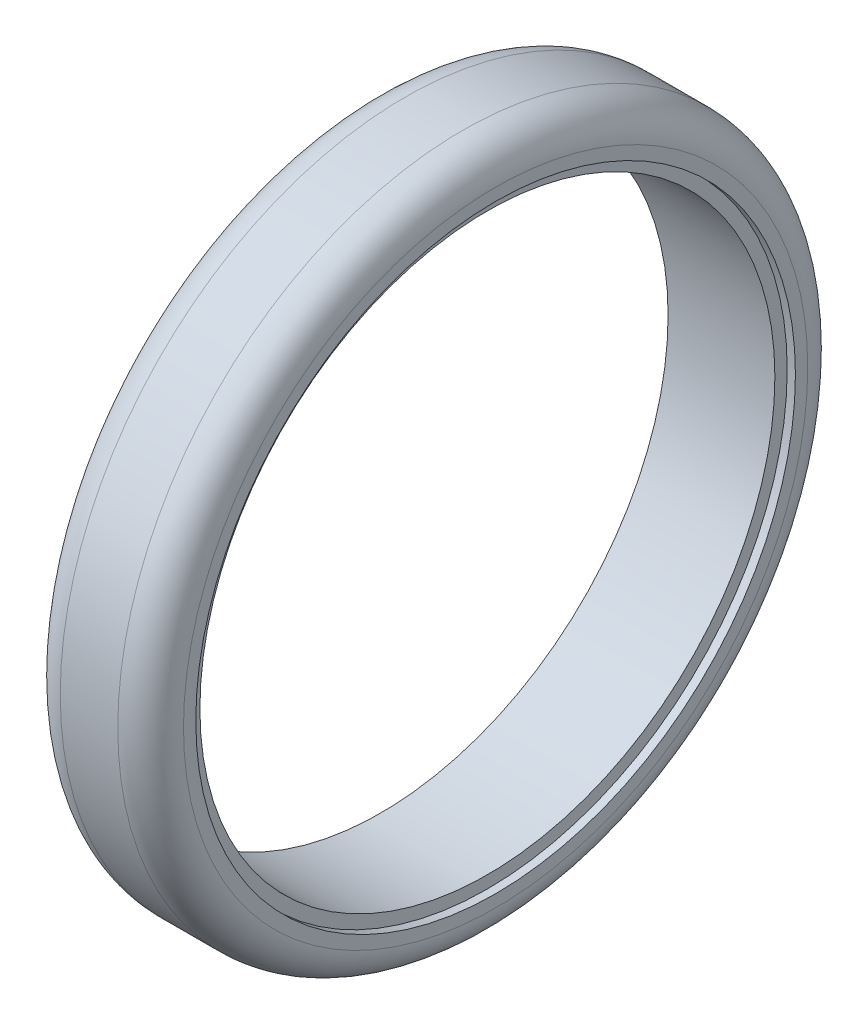
ISO-10303-21;
HEADER;
FILE_DESCRIPTION(('STEP AP214'),'2;1');
FILE_NAME('part.step','',(''),(''),'','','');
FILE_SCHEMA(('AUTOMOTIVE_DESIGN { 1 0 10303 214 1 1 1 1 }'));
ENDSEC;
DATA;
#1=APPLICATION_CONTEXT('core data for automotive mechanical design processes');
#2=APPLICATION_PROTOCOL_DEFINITION('international standard','automotive_design',2000,#1);
#3=PRODUCT_CONTEXT('',#1,'mechanical');
#4=PRODUCT('Part','Part','',(#3));
#5=PRODUCT_RELATED_PRODUCT_CATEGORY('part','',(#4));
#6=PRODUCT_DEFINITION_FORMATION('','',#4);
#7=PRODUCT_DEFINITION_CONTEXT('part definition',#1,'design');
#8=PRODUCT_DEFINITION('design','',#6,#7);
#9=PRODUCT_DEFINITION_SHAPE('','',#8);
#10=(LENGTH_UNIT() NAMED_UNIT(*) SI_UNIT(.MILLI.,.METRE.));
#11=(NAMED_UNIT(*) PLANE_ANGLE_UNIT() SI_UNIT($,.RADIAN.));
#12=(NAMED_UNIT(*) SI_UNIT($,.STERADIAN.) SOLID_ANGLE_UNIT());
#13=UNCERTAINTY_MEASURE_WITH_UNIT(LENGTH_MEASURE(1.E-05),#10,'distance_accuracy_value','');
#14=(GEOMETRIC_REPRESENTATION_CONTEXT(3) GLOBAL_UNCERTAINTY_ASSIGNED_CONTEXT((#13)) GLOBAL_UNIT_ASSIGNED_CONTEXT((#10,
#11,#12)) REPRESENTATION_CONTEXT('',''));
#15=CARTESIAN_POINT('',(0.,0.,0.));
#16=DIRECTION('',(0.,0.,1.));
#17=DIRECTION('',(1.,0.,0.));
#18=AXIS2_PLACEMENT_3D('',#15,#16,#17);
#19=CARTESIAN_POINT('',(3.5,0.,0.));
#20=DIRECTION('',(-1.,0.,0.));
#21=DIRECTION('',(0.,0.,1.));
#22=AXIS2_PLACEMENT_3D('',#19,#20,#21);
#23=TOROIDAL_SURFACE('',#22,38.,4.);
#24=CARTESIAN_POINT('',(3.5,0.,0.));
#25=DIRECTION('',(-1.,0.,0.));
#26=DIRECTION('',(0.,0.,1.));
#27=AXIS2_PLACEMENT_3D('',#24,#25,#26);
#28=CIRCLE('',#27,42.);
#29=CARTESIAN_POINT('',(3.5,0.,42.));
#30=VERTEX_POINT('',#29);
#31=EDGE_CURVE('E10',#30,#30,#28,.T.);
#32=ORIENTED_EDGE('',*,*,#31,.F.);
#33=EDGE_LOOP('',(#32));
#34=FACE_BOUND('',#33,.T.);
#35=CARTESIAN_POINT('',(7.5,0.,0.));
#36=DIRECTION('',(-1.,0.,0.));
#37=DIRECTION('',(0.,0.,1.));
#38=AXIS2_PLACEMENT_3D('',#35,#36,#37);
#39=CIRCLE('',#38,38.);
#40=CARTESIAN_POINT('',(7.5,0.,38.));
#41=VERTEX_POINT('',#40);
#42=EDGE_CURVE('E88',#41,#41,#39,.T.);
#43=ORIENTED_EDGE('',*,*,#42,.T.);
#44=EDGE_LOOP('',(#43));
#45=FACE_BOUND('',#44,.T.);
#46=ADVANCED_FACE('F45',(#34,#45),#23,.T.);
#47=CARTESIAN_POINT('',(-13.4108184609654,0.,0.));
#48=DIRECTION('',(-1.,0.,0.));
#49=DIRECTION('',(0.,0.,1.));
#50=AXIS2_PLACEMENT_3D('',#47,#48,#49);
#51=CYLINDRICAL_SURFACE('',#50,42.);
#52=ORIENTED_EDGE('',*,*,#31,.T.);
#53=EDGE_LOOP('',(#52));
#54=FACE_BOUND('',#53,.T.);
#55=CARTESIAN_POINT('',(-3.5,0.,0.));
#56=DIRECTION('',(-1.,0.,0.));
#57=DIRECTION('',(0.,0.,1.));
#58=AXIS2_PLACEMENT_3D('',#55,#56,#57);
#59=CIRCLE('',#58,42.);
#60=CARTESIAN_POINT('',(-3.5,0.,42.));
#61=VERTEX_POINT('',#60);
#62=EDGE_CURVE('E52',#61,#61,#59,.T.);
#63=ORIENTED_EDGE('',*,*,#62,.F.);
#64=EDGE_LOOP('',(#63));
#65=FACE_BOUND('',#64,.T.);
#66=ADVANCED_FACE('F130',(#54,#65),#51,.T.);
#67=CARTESIAN_POINT('',(-3.5,0.,0.));
#68=DIRECTION('',(-1.,0.,0.));
#69=DIRECTION('',(0.,0.,1.));
#70=AXIS2_PLACEMENT_3D('',#67,#68,#69);
#71=TOROIDAL_SURFACE('',#70,38.,4.);
#72=CARTESIAN_POINT('',(-7.5,0.,0.));
#73=DIRECTION('',(-1.,0.,0.));
#74=DIRECTION('',(0.,0.,1.));
#75=AXIS2_PLACEMENT_3D('',#72,#73,#74);
#76=CIRCLE('',#75,38.);
#77=CARTESIAN_POINT('',(-7.5,0.,38.));
#78=VERTEX_POINT('',#77);
#79=EDGE_CURVE('E57',#78,#78,#76,.T.);
#80=ORIENTED_EDGE('',*,*,#79,.F.);
#81=EDGE_LOOP('',(#80));
#82=FACE_BOUND('',#81,.T.);
#83=ORIENTED_EDGE('',*,*,#62,.T.);
#84=EDGE_LOOP('',(#83));
#85=FACE_BOUND('',#84,.T.);
#86=ADVANCED_FACE('F135',(#82,#85),#71,.T.);
#87=CARTESIAN_POINT('',(-7.5,0.,0.));
#88=DIRECTION('',(-1.,0.,0.));
#89=DIRECTION('',(0.,0.,1.));
#90=AXIS2_PLACEMENT_3D('',#87,#88,#89);
#91=PLANE('',#90);
#92=ORIENTED_EDGE('',*,*,#79,.T.);
#93=EDGE_LOOP('',(#92));
#94=FACE_BOUND('',#93,.T.);
#95=CARTESIAN_POINT('',(-7.5,0.,0.));
#96=DIRECTION('',(-1.,0.,0.));
#97=DIRECTION('',(0.,0.,1.));
#98=AXIS2_PLACEMENT_3D('',#95,#96,#97);
#99=CIRCLE('',#98,36.5);
#100=CARTESIAN_POINT('',(-7.5,0.,36.5));
#101=VERTEX_POINT('',#100);
#102=EDGE_CURVE('E62',#101,#101,#99,.T.);
#103=ORIENTED_EDGE('',*,*,#102,.F.);
#104=EDGE_LOOP('',(#103));
#105=FACE_BOUND('',#104,.T.);
#106=ADVANCED_FACE('F126',(#94,#105),#91,.T.);
#107=CARTESIAN_POINT('',(-13.4108184609654,0.,0.));
#108=DIRECTION('',(-1.,0.,0.));
#109=DIRECTION('',(0.,0.,1.));
#110=AXIS2_PLACEMENT_3D('',#107,#108,#109);
#111=CYLINDRICAL_SURFACE('',#110,36.5);
#112=ORIENTED_EDGE('',*,*,#102,.T.);
#113=EDGE_LOOP('',(#112));
#114=FACE_BOUND('',#113,.T.);
#115=CARTESIAN_POINT('',(-6.5,0.,0.));
#116=DIRECTION('',(-1.,0.,0.));
#117=DIRECTION('',(0.,0.,1.));
#118=AXIS2_PLACEMENT_3D('',#115,#116,#117);
#119=CIRCLE('',#118,36.5);
#120=CARTESIAN_POINT('',(-6.5,0.,36.5));
#121=VERTEX_POINT('',#120);
#122=EDGE_CURVE('E68',#121,#121,#119,.T.);
#123=ORIENTED_EDGE('',*,*,#122,.F.);
#124=EDGE_LOOP('',(#123));
#125=FACE_BOUND('',#124,.T.);
#126=ADVANCED_FACE('F120',(#114,#125),#111,.F.);
#127=CARTESIAN_POINT('',(-6.5,0.,0.));
#128=DIRECTION('',(-1.,0.,0.));
#129=DIRECTION('',(0.,0.,1.));
#130=AXIS2_PLACEMENT_3D('',#127,#128,#129);
#131=PLANE('',#130);
#132=ORIENTED_EDGE('',*,*,#122,.T.);
#133=EDGE_LOOP('',(#132));
#134=FACE_BOUND('',#133,.T.);
#135=CARTESIAN_POINT('',(-6.5,0.,0.));
#136=DIRECTION('',(-1.,0.,0.));
#137=DIRECTION('',(0.,0.,1.));
#138=AXIS2_PLACEMENT_3D('',#135,#136,#137);
#139=CIRCLE('',#138,35.);
#140=CARTESIAN_POINT('',(-6.5,0.,35.));
#141=VERTEX_POINT('',#140);
#142=EDGE_CURVE('E72',#141,#141,#139,.T.);
#143=ORIENTED_EDGE('',*,*,#142,.F.);
#144=EDGE_LOOP('',(#143));
#145=FACE_BOUND('',#144,.T.);
#146=ADVANCED_FACE('F115',(#134,#145),#131,.T.);
#147=CARTESIAN_POINT('',(-13.4108184609654,0.,0.));
#148=DIRECTION('',(-1.,0.,0.));
#149=DIRECTION('',(0.,0.,1.));
#150=AXIS2_PLACEMENT_3D('',#147,#148,#149);
#151=CYLINDRICAL_SURFACE('',#150,35.);
#152=CARTESIAN_POINT('',(6.5,0.,0.));
#153=DIRECTION('',(-1.,0.,0.));
#154=DIRECTION('',(0.,0.,1.));
#155=AXIS2_PLACEMENT_3D('',#152,#153,#154);
#156=CIRCLE('',#155,35.);
#157=CARTESIAN_POINT('',(6.5,0.,35.));
#158=VERTEX_POINT('',#157);
#159=EDGE_CURVE('E76',#158,#158,#156,.T.);
#160=ORIENTED_EDGE('',*,*,#159,.F.);
#161=EDGE_LOOP('',(#160));
#162=FACE_BOUND('',#161,.T.);
#163=ORIENTED_EDGE('',*,*,#142,.T.);
#164=EDGE_LOOP('',(#163));
#165=FACE_BOUND('',#164,.T.);
#166=ADVANCED_FACE('F109',(#162,#165),#151,.F.);
#167=CARTESIAN_POINT('',(6.5,0.,0.));
#168=DIRECTION('',(-1.,0.,0.));
#169=DIRECTION('',(0.,0.,1.));
#170=AXIS2_PLACEMENT_3D('',#167,#168,#169);
#171=PLANE('',#170);
#172=CARTESIAN_POINT('',(6.5,0.,0.));
#173=DIRECTION('',(-1.,0.,0.));
#174=DIRECTION('',(0.,0.,1.));
#175=AXIS2_PLACEMENT_3D('',#172,#173,#174);
#176=CIRCLE('',#175,36.5);
#177=CARTESIAN_POINT('',(6.5,0.,36.5));
#178=VERTEX_POINT('',#177);
#179=EDGE_CURVE('E80',#178,#178,#176,.T.);
#180=ORIENTED_EDGE('',*,*,#179,.F.);
#181=EDGE_LOOP('',(#180));
#182=FACE_BOUND('',#181,.T.);
#183=ORIENTED_EDGE('',*,*,#159,.T.);
#184=EDGE_LOOP('',(#183));
#185=FACE_BOUND('',#184,.T.);
#186=ADVANCED_FACE('F103',(#182,#185),#171,.F.);
#187=CARTESIAN_POINT('',(-13.4108184609654,0.,0.));
#188=DIRECTION('',(-1.,0.,0.));
#189=DIRECTION('',(0.,0.,1.));
#190=AXIS2_PLACEMENT_3D('',#187,#188,#189);
#191=CYLINDRICAL_SURFACE('',#190,36.5);
#192=CARTESIAN_POINT('',(7.5,0.,0.));
#193=DIRECTION('',(-1.,0.,0.));
#194=DIRECTION('',(0.,0.,1.));
#195=AXIS2_PLACEMENT_3D('',#192,#193,#194);
#196=CIRCLE('',#195,36.5);
#197=CARTESIAN_POINT('',(7.5,0.,36.5));
#198=VERTEX_POINT('',#197);
#199=EDGE_CURVE('E84',#198,#198,#196,.T.);
#200=ORIENTED_EDGE('',*,*,#199,.F.);
#201=EDGE_LOOP('',(#200));
#202=FACE_BOUND('',#201,.T.);
#203=ORIENTED_EDGE('',*,*,#179,.T.);
#204=EDGE_LOOP('',(#203));
#205=FACE_BOUND('',#204,.T.);
#206=ADVANCED_FACE('F97',(#202,#205),#191,.F.);
#207=CARTESIAN_POINT('',(7.5,0.,0.));
#208=DIRECTION('',(-1.,0.,0.));
#209=DIRECTION('',(0.,0.,1.));
#210=AXIS2_PLACEMENT_3D('',#207,#208,#209);
#211=PLANE('',#210);
#212=ORIENTED_EDGE('',*,*,#42,.F.);
#213=EDGE_LOOP('',(#212));
#214=FACE_BOUND('',#213,.T.);
#215=ORIENTED_EDGE('',*,*,#199,.T.);
#216=EDGE_LOOP('',(#215));
#217=FACE_BOUND('',#216,.T.);
#218=ADVANCED_FACE('F94',(#214,#217),#211,.F.);
#219=CLOSED_SHELL('',(#46,#66,#86,#106,#126,#146,#166,#186,#206,#218));
#220=MANIFOLD_SOLID_BREP('B2',#219);
#221=ADVANCED_BREP_SHAPE_REPRESENTATION('',(#18,#220),#14);
#222=SHAPE_DEFINITION_REPRESENTATION(#9,#221);
ENDSEC;
END-ISO-10303-21;
